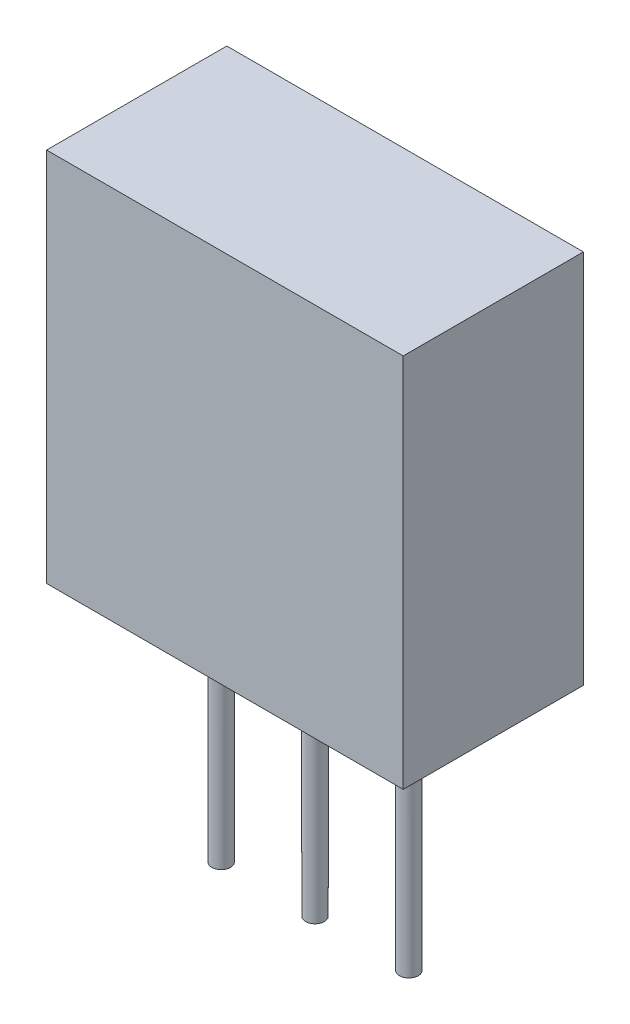
ISO-10303-21;
HEADER;
FILE_DESCRIPTION(('STEP AP214'),'2;1');
FILE_NAME('part.step','',(''),(''),'','','');
FILE_SCHEMA(('AUTOMOTIVE_DESIGN { 1 0 10303 214 1 1 1 1 }'));
ENDSEC;
DATA;
#1=APPLICATION_CONTEXT('core data for automotive mechanical design processes');
#2=APPLICATION_PROTOCOL_DEFINITION('international standard','automotive_design',2000,#1);
#3=PRODUCT_CONTEXT('',#1,'mechanical');
#4=PRODUCT('Part','Part','',(#3));
#5=PRODUCT_RELATED_PRODUCT_CATEGORY('part','',(#4));
#6=PRODUCT_DEFINITION_FORMATION('','',#4);
#7=PRODUCT_DEFINITION_CONTEXT('part definition',#1,'design');
#8=PRODUCT_DEFINITION('design','',#6,#7);
#9=PRODUCT_DEFINITION_SHAPE('','',#8);
#10=(LENGTH_UNIT() NAMED_UNIT(*) SI_UNIT(.MILLI.,.METRE.));
#11=(NAMED_UNIT(*) PLANE_ANGLE_UNIT() SI_UNIT($,.RADIAN.));
#12=(NAMED_UNIT(*) SI_UNIT($,.STERADIAN.) SOLID_ANGLE_UNIT());
#13=UNCERTAINTY_MEASURE_WITH_UNIT(LENGTH_MEASURE(1.E-05),#10,'distance_accuracy_value','');
#14=(GEOMETRIC_REPRESENTATION_CONTEXT(3) GLOBAL_UNCERTAINTY_ASSIGNED_CONTEXT((#13)) GLOBAL_UNIT_ASSIGNED_CONTEXT((#10,
#11,#12)) REPRESENTATION_CONTEXT('',''));
#15=CARTESIAN_POINT('',(0.,0.,0.));
#16=DIRECTION('',(0.,0.,1.));
#17=DIRECTION('',(1.,0.,0.));
#18=AXIS2_PLACEMENT_3D('',#15,#16,#17);
#19=CARTESIAN_POINT('',(0.,0.,4.8));
#20=DIRECTION('',(1.,0.,0.));
#21=DIRECTION('',(0.,0.,-1.));
#22=AXIS2_PLACEMENT_3D('',#19,#20,#21);
#23=PLANE('',#22);
#24=DIRECTION('',(0.,-1.,0.));
#25=VECTOR('',#24,1.);
#26=CARTESIAN_POINT('',(0.,0.,0.));
#27=LINE('',#26,#25);
#28=CARTESIAN_POINT('',(0.,10.,0.));
#29=VERTEX_POINT('',#28);
#30=CARTESIAN_POINT('',(0.,0.,0.));
#31=VERTEX_POINT('',#30);
#32=EDGE_CURVE('E100',#29,#31,#27,.T.);
#33=ORIENTED_EDGE('',*,*,#32,.T.);
#34=DIRECTION('',(0.,0.,-1.));
#35=VECTOR('',#34,1.);
#36=CARTESIAN_POINT('',(0.,0.,4.8));
#37=LINE('',#36,#35);
#38=CARTESIAN_POINT('',(0.,0.,4.8));
#39=VERTEX_POINT('',#38);
#40=EDGE_CURVE('E91',#39,#31,#37,.T.);
#41=ORIENTED_EDGE('',*,*,#40,.F.);
#42=DIRECTION('',(0.,-1.,0.));
#43=VECTOR('',#42,1.);
#44=CARTESIAN_POINT('',(0.,0.,4.8));
#45=LINE('',#44,#43);
#46=CARTESIAN_POINT('',(0.,10.,4.8));
#47=VERTEX_POINT('',#46);
#48=EDGE_CURVE('E85',#47,#39,#45,.T.);
#49=ORIENTED_EDGE('',*,*,#48,.F.);
#50=DIRECTION('',(0.,0.,-1.));
#51=VECTOR('',#50,1.);
#52=CARTESIAN_POINT('',(0.,10.,4.8));
#53=LINE('',#52,#51);
#54=EDGE_CURVE('E96',#47,#29,#53,.T.);
#55=ORIENTED_EDGE('',*,*,#54,.T.);
#56=EDGE_LOOP('',(#33,#41,#49,#55));
#57=FACE_BOUND('',#56,.T.);
#58=ADVANCED_FACE('F33',(#57),#23,.F.);
#59=CARTESIAN_POINT('',(0.,0.,4.8));
#60=DIRECTION('',(0.,1.,0.));
#61=DIRECTION('',(0.,0.,1.));
#62=AXIS2_PLACEMENT_3D('',#59,#60,#61);
#63=PLANE('',#62);
#64=CARTESIAN_POINT('',(7.25,0.,2.4));
#65=DIRECTION('',(0.,1.,0.));
#66=DIRECTION('',(0.,0.,1.));
#67=AXIS2_PLACEMENT_3D('',#64,#65,#66);
#68=CIRCLE('',#67,0.25);
#69=CARTESIAN_POINT('',(7.25,0.,2.65));
#70=VERTEX_POINT('',#69);
#71=EDGE_CURVE('E11',#70,#70,#68,.F.);
#72=ORIENTED_EDGE('',*,*,#71,.F.);
#73=EDGE_LOOP('',(#72));
#74=FACE_BOUND('',#73,.T.);
#75=CARTESIAN_POINT('',(2.25,0.,2.4));
#76=DIRECTION('',(0.,1.,0.));
#77=DIRECTION('',(0.,0.,1.));
#78=AXIS2_PLACEMENT_3D('',#75,#76,#77);
#79=CIRCLE('',#78,0.250000000000001);
#80=CARTESIAN_POINT('',(2.25,0.,2.65));
#81=VERTEX_POINT('',#80);
#82=EDGE_CURVE('E41',#81,#81,#79,.F.);
#83=ORIENTED_EDGE('',*,*,#82,.F.);
#84=EDGE_LOOP('',(#83));
#85=FACE_BOUND('',#84,.T.);
#86=CARTESIAN_POINT('',(4.75,0.,2.4));
#87=DIRECTION('',(0.,1.,0.));
#88=DIRECTION('',(0.,0.,1.));
#89=AXIS2_PLACEMENT_3D('',#86,#87,#88);
#90=CIRCLE('',#89,0.25);
#91=CARTESIAN_POINT('',(4.75,0.,2.65));
#92=VERTEX_POINT('',#91);
#93=EDGE_CURVE('E110',#92,#92,#90,.F.);
#94=ORIENTED_EDGE('',*,*,#93,.F.);
#95=EDGE_LOOP('',(#94));
#96=FACE_BOUND('',#95,.T.);
#97=DIRECTION('',(1.,0.,0.));
#98=VECTOR('',#97,1.);
#99=CARTESIAN_POINT('',(0.,0.,0.));
#100=LINE('',#99,#98);
#101=CARTESIAN_POINT('',(9.5,0.,0.));
#102=VERTEX_POINT('',#101);
#103=EDGE_CURVE('E90',#31,#102,#100,.T.);
#104=ORIENTED_EDGE('',*,*,#103,.T.);
#105=DIRECTION('',(0.,0.,-1.));
#106=VECTOR('',#105,1.);
#107=CARTESIAN_POINT('',(9.5,0.,4.8));
#108=LINE('',#107,#106);
#109=CARTESIAN_POINT('',(9.5,0.,4.8));
#110=VERTEX_POINT('',#109);
#111=EDGE_CURVE('E88',#110,#102,#108,.T.);
#112=ORIENTED_EDGE('',*,*,#111,.F.);
#113=DIRECTION('',(1.,0.,0.));
#114=VECTOR('',#113,1.);
#115=CARTESIAN_POINT('',(0.,0.,4.8));
#116=LINE('',#115,#114);
#117=EDGE_CURVE('E80',#39,#110,#116,.T.);
#118=ORIENTED_EDGE('',*,*,#117,.F.);
#119=ORIENTED_EDGE('',*,*,#40,.T.);
#120=EDGE_LOOP('',(#104,#112,#118,#119));
#121=FACE_BOUND('',#120,.T.);
#122=ADVANCED_FACE('F89',(#74,#85,#96,#121),#63,.F.);
#123=CARTESIAN_POINT('',(9.5,0.,4.8));
#124=DIRECTION('',(-1.,0.,0.));
#125=DIRECTION('',(0.,0.,1.));
#126=AXIS2_PLACEMENT_3D('',#123,#124,#125);
#127=PLANE('',#126);
#128=DIRECTION('',(0.,1.,0.));
#129=VECTOR('',#128,1.);
#130=CARTESIAN_POINT('',(9.5,0.,0.));
#131=LINE('',#130,#129);
#132=CARTESIAN_POINT('',(9.5,10.,0.));
#133=VERTEX_POINT('',#132);
#134=EDGE_CURVE('E66',#102,#133,#131,.T.);
#135=ORIENTED_EDGE('',*,*,#134,.T.);
#136=DIRECTION('',(0.,0.,-1.));
#137=VECTOR('',#136,1.);
#138=CARTESIAN_POINT('',(9.5,10.,4.8));
#139=LINE('',#138,#137);
#140=CARTESIAN_POINT('',(9.5,10.,4.8));
#141=VERTEX_POINT('',#140);
#142=EDGE_CURVE('E92',#141,#133,#139,.T.);
#143=ORIENTED_EDGE('',*,*,#142,.F.);
#144=DIRECTION('',(0.,1.,0.));
#145=VECTOR('',#144,1.);
#146=CARTESIAN_POINT('',(9.5,0.,4.8));
#147=LINE('',#146,#145);
#148=EDGE_CURVE('E83',#110,#141,#147,.T.);
#149=ORIENTED_EDGE('',*,*,#148,.F.);
#150=ORIENTED_EDGE('',*,*,#111,.T.);
#151=EDGE_LOOP('',(#135,#143,#149,#150));
#152=FACE_BOUND('',#151,.T.);
#153=ADVANCED_FACE('F94',(#152),#127,.F.);
#154=CARTESIAN_POINT('',(0.,10.,4.8));
#155=DIRECTION('',(0.,-1.,0.));
#156=DIRECTION('',(0.,0.,-1.));
#157=AXIS2_PLACEMENT_3D('',#154,#155,#156);
#158=PLANE('',#157);
#159=DIRECTION('',(-1.,0.,0.));
#160=VECTOR('',#159,1.);
#161=CARTESIAN_POINT('',(0.,10.,0.));
#162=LINE('',#161,#160);
#163=EDGE_CURVE('E72',#133,#29,#162,.T.);
#164=ORIENTED_EDGE('',*,*,#163,.T.);
#165=ORIENTED_EDGE('',*,*,#54,.F.);
#166=DIRECTION('',(-1.,0.,0.));
#167=VECTOR('',#166,1.);
#168=CARTESIAN_POINT('',(0.,10.,4.8));
#169=LINE('',#168,#167);
#170=EDGE_CURVE('E49',#141,#47,#169,.T.);
#171=ORIENTED_EDGE('',*,*,#170,.F.);
#172=ORIENTED_EDGE('',*,*,#142,.T.);
#173=EDGE_LOOP('',(#164,#165,#171,#172));
#174=FACE_BOUND('',#173,.T.);
#175=ADVANCED_FACE('F144',(#174),#158,.F.);
#176=CARTESIAN_POINT('',(0.,0.,4.8));
#177=DIRECTION('',(0.,0.,-1.));
#178=DIRECTION('',(-1.,0.,0.));
#179=AXIS2_PLACEMENT_3D('',#176,#177,#178);
#180=PLANE('',#179);
#181=ORIENTED_EDGE('',*,*,#48,.T.);
#182=ORIENTED_EDGE('',*,*,#117,.T.);
#183=ORIENTED_EDGE('',*,*,#148,.T.);
#184=ORIENTED_EDGE('',*,*,#170,.T.);
#185=EDGE_LOOP('',(#181,#182,#183,#184));
#186=FACE_BOUND('',#185,.T.);
#187=ADVANCED_FACE('F81',(#186),#180,.F.);
#188=CARTESIAN_POINT('',(0.,0.,0.));
#189=DIRECTION('',(0.,0.,-1.));
#190=DIRECTION('',(-1.,0.,0.));
#191=AXIS2_PLACEMENT_3D('',#188,#189,#190);
#192=PLANE('',#191);
#193=ORIENTED_EDGE('',*,*,#32,.F.);
#194=ORIENTED_EDGE('',*,*,#163,.F.);
#195=ORIENTED_EDGE('',*,*,#134,.F.);
#196=ORIENTED_EDGE('',*,*,#103,.F.);
#197=EDGE_LOOP('',(#193,#194,#195,#196));
#198=FACE_BOUND('',#197,.T.);
#199=ADVANCED_FACE('F125',(#198),#192,.T.);
#200=CARTESIAN_POINT('',(4.75,-6.5,2.4));
#201=DIRECTION('',(0.,1.,0.));
#202=DIRECTION('',(0.,0.,1.));
#203=AXIS2_PLACEMENT_3D('',#200,#201,#202);
#204=CYLINDRICAL_SURFACE('',#203,0.25);
#205=CARTESIAN_POINT('',(4.75,-6.5,2.4));
#206=DIRECTION('',(0.,-1.,0.));
#207=DIRECTION('',(0.,0.,-1.));
#208=AXIS2_PLACEMENT_3D('',#205,#206,#207);
#209=CIRCLE('',#208,0.25);
#210=CARTESIAN_POINT('',(4.75,-6.5,2.15));
#211=VERTEX_POINT('',#210);
#212=EDGE_CURVE('E103',#211,#211,#209,.T.);
#213=ORIENTED_EDGE('',*,*,#212,.F.);
#214=EDGE_LOOP('',(#213));
#215=FACE_BOUND('',#214,.T.);
#216=ORIENTED_EDGE('',*,*,#93,.T.);
#217=EDGE_LOOP('',(#216));
#218=FACE_BOUND('',#217,.T.);
#219=ADVANCED_FACE('F122',(#215,#218),#204,.T.);
#220=CARTESIAN_POINT('',(4.75,-6.5,2.4));
#221=DIRECTION('',(0.,-1.,0.));
#222=DIRECTION('',(0.,0.,-1.));
#223=AXIS2_PLACEMENT_3D('',#220,#221,#222);
#224=PLANE('',#223);
#225=ORIENTED_EDGE('',*,*,#212,.T.);
#226=EDGE_LOOP('',(#225));
#227=FACE_BOUND('',#226,.T.);
#228=ADVANCED_FACE('F124',(#227),#224,.T.);
#229=CARTESIAN_POINT('',(2.25,-6.5,2.4));
#230=DIRECTION('',(0.,1.,0.));
#231=DIRECTION('',(0.,0.,1.));
#232=AXIS2_PLACEMENT_3D('',#229,#230,#231);
#233=CYLINDRICAL_SURFACE('',#232,0.250000000000001);
#234=CARTESIAN_POINT('',(2.25,-6.5,2.4));
#235=DIRECTION('',(0.,-1.,0.));
#236=DIRECTION('',(0.,0.,-1.));
#237=AXIS2_PLACEMENT_3D('',#234,#235,#236);
#238=CIRCLE('',#237,0.250000000000001);
#239=CARTESIAN_POINT('',(2.25,-6.5,2.15));
#240=VERTEX_POINT('',#239);
#241=EDGE_CURVE('E218',#240,#240,#238,.T.);
#242=ORIENTED_EDGE('',*,*,#241,.F.);
#243=EDGE_LOOP('',(#242));
#244=FACE_BOUND('',#243,.T.);
#245=ORIENTED_EDGE('',*,*,#82,.T.);
#246=EDGE_LOOP('',(#245));
#247=FACE_BOUND('',#246,.T.);
#248=ADVANCED_FACE('F115',(#244,#247),#233,.T.);
#249=CARTESIAN_POINT('',(2.25,-6.5,2.4));
#250=DIRECTION('',(0.,-1.,0.));
#251=DIRECTION('',(0.,0.,-1.));
#252=AXIS2_PLACEMENT_3D('',#249,#250,#251);
#253=PLANE('',#252);
#254=ORIENTED_EDGE('',*,*,#241,.T.);
#255=EDGE_LOOP('',(#254));
#256=FACE_BOUND('',#255,.T.);
#257=ADVANCED_FACE('F181',(#256),#253,.T.);
#258=CARTESIAN_POINT('',(7.25,-6.5,2.4));
#259=DIRECTION('',(0.,1.,0.));
#260=DIRECTION('',(0.,0.,1.));
#261=AXIS2_PLACEMENT_3D('',#258,#259,#260);
#262=CYLINDRICAL_SURFACE('',#261,0.25);
#263=CARTESIAN_POINT('',(7.25,-6.5,2.4));
#264=DIRECTION('',(0.,-1.,0.));
#265=DIRECTION('',(0.,0.,-1.));
#266=AXIS2_PLACEMENT_3D('',#263,#264,#265);
#267=CIRCLE('',#266,0.25);
#268=CARTESIAN_POINT('',(7.25,-6.5,2.15));
#269=VERTEX_POINT('',#268);
#270=EDGE_CURVE('E217',#269,#269,#267,.T.);
#271=ORIENTED_EDGE('',*,*,#270,.F.);
#272=EDGE_LOOP('',(#271));
#273=FACE_BOUND('',#272,.T.);
#274=ORIENTED_EDGE('',*,*,#71,.T.);
#275=EDGE_LOOP('',(#274));
#276=FACE_BOUND('',#275,.T.);
#277=ADVANCED_FACE('F191',(#273,#276),#262,.T.);
#278=CARTESIAN_POINT('',(7.25,-6.5,2.4));
#279=DIRECTION('',(0.,-1.,0.));
#280=DIRECTION('',(0.,0.,-1.));
#281=AXIS2_PLACEMENT_3D('',#278,#279,#280);
#282=PLANE('',#281);
#283=ORIENTED_EDGE('',*,*,#270,.T.);
#284=EDGE_LOOP('',(#283));
#285=FACE_BOUND('',#284,.T.);
#286=ADVANCED_FACE('F201',(#285),#282,.T.);
#287=CLOSED_SHELL('',(#58,#122,#153,#175,#187,#199,#219,#228,#248,#257,#277,#286));
#288=MANIFOLD_SOLID_BREP('B2',#287);
#289=ADVANCED_BREP_SHAPE_REPRESENTATION('',(#18,#288),#14);
#290=SHAPE_DEFINITION_REPRESENTATION(#9,#289);
ENDSEC;
END-ISO-10303-21;
